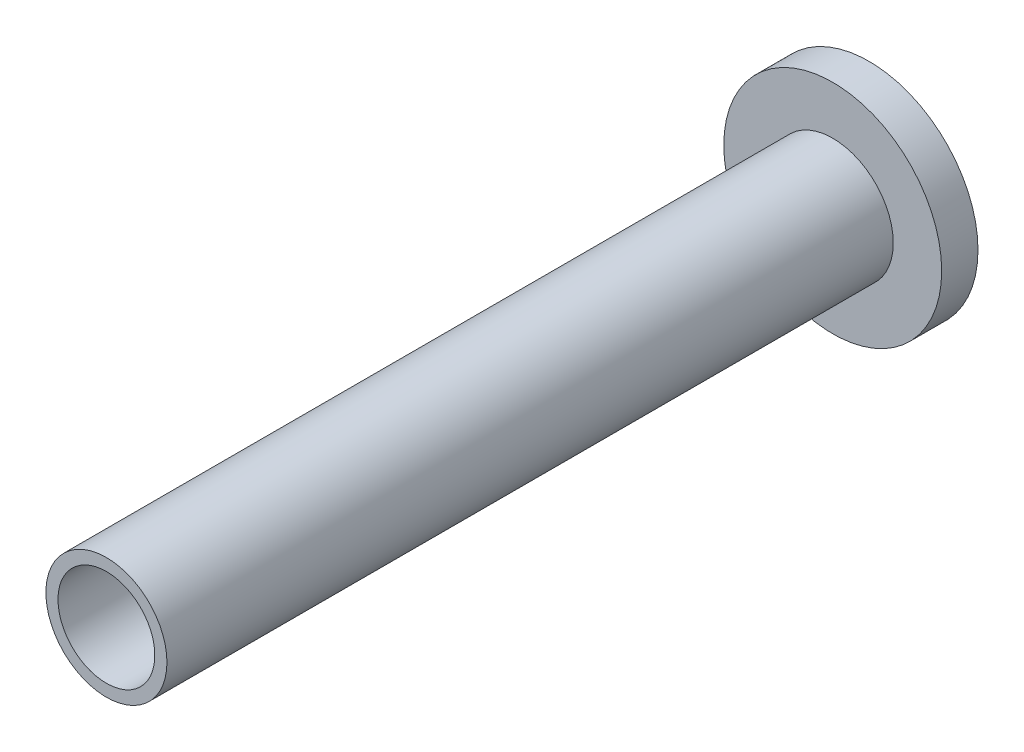
ISO-10303-21;
HEADER;
FILE_DESCRIPTION(('STEP AP214'),'2;1');
FILE_NAME('part.step','',(''),(''),'','','');
FILE_SCHEMA(('AUTOMOTIVE_DESIGN { 1 0 10303 214 1 1 1 1 }'));
ENDSEC;
DATA;
#1=APPLICATION_CONTEXT('core data for automotive mechanical design processes');
#2=APPLICATION_PROTOCOL_DEFINITION('international standard','automotive_design',2000,#1);
#3=PRODUCT_CONTEXT('',#1,'mechanical');
#4=PRODUCT('Part','Part','',(#3));
#5=PRODUCT_RELATED_PRODUCT_CATEGORY('part','',(#4));
#6=PRODUCT_DEFINITION_FORMATION('','',#4);
#7=PRODUCT_DEFINITION_CONTEXT('part definition',#1,'design');
#8=PRODUCT_DEFINITION('design','',#6,#7);
#9=PRODUCT_DEFINITION_SHAPE('','',#8);
#10=(LENGTH_UNIT() NAMED_UNIT(*) SI_UNIT(.MILLI.,.METRE.));
#11=(NAMED_UNIT(*) PLANE_ANGLE_UNIT() SI_UNIT($,.RADIAN.));
#12=(NAMED_UNIT(*) SI_UNIT($,.STERADIAN.) SOLID_ANGLE_UNIT());
#13=UNCERTAINTY_MEASURE_WITH_UNIT(LENGTH_MEASURE(1.E-05),#10,'distance_accuracy_value','');
#14=(GEOMETRIC_REPRESENTATION_CONTEXT(3) GLOBAL_UNCERTAINTY_ASSIGNED_CONTEXT((#13)) GLOBAL_UNIT_ASSIGNED_CONTEXT((#10,
#11,#12)) REPRESENTATION_CONTEXT('',''));
#15=CARTESIAN_POINT('',(0.,0.,0.));
#16=DIRECTION('',(0.,0.,1.));
#17=DIRECTION('',(1.,0.,0.));
#18=AXIS2_PLACEMENT_3D('',#15,#16,#17);
#19=CARTESIAN_POINT('',(0.,0.,30.));
#20=DIRECTION('',(0.,0.,-1.));
#21=DIRECTION('',(-1.,0.,0.));
#22=AXIS2_PLACEMENT_3D('',#19,#20,#21);
#23=CYLINDRICAL_SURFACE('',#22,2.5);
#24=CARTESIAN_POINT('',(0.,0.,30.));
#25=DIRECTION('',(0.,0.,1.));
#26=DIRECTION('',(1.,0.,0.));
#27=AXIS2_PLACEMENT_3D('',#24,#25,#26);
#28=CIRCLE('',#27,2.5);
#29=CARTESIAN_POINT('',(2.5,0.,30.));
#30=VERTEX_POINT('',#29);
#31=EDGE_CURVE('E11',#30,#30,#28,.T.);
#32=ORIENTED_EDGE('',*,*,#31,.F.);
#33=EDGE_LOOP('',(#32));
#34=FACE_BOUND('',#33,.T.);
#35=CARTESIAN_POINT('',(0.,0.,0.));
#36=DIRECTION('',(0.,0.,1.));
#37=DIRECTION('',(1.,0.,0.));
#38=AXIS2_PLACEMENT_3D('',#35,#36,#37);
#39=CIRCLE('',#38,2.5);
#40=CARTESIAN_POINT('',(2.5,0.,0.));
#41=VERTEX_POINT('',#40);
#42=EDGE_CURVE('E57',#41,#41,#39,.T.);
#43=ORIENTED_EDGE('',*,*,#42,.T.);
#44=EDGE_LOOP('',(#43));
#45=FACE_BOUND('',#44,.T.);
#46=ADVANCED_FACE('F49',(#34,#45),#23,.T.);
#47=CARTESIAN_POINT('',(0.,0.,30.));
#48=DIRECTION('',(0.,0.,1.));
#49=DIRECTION('',(1.,0.,0.));
#50=AXIS2_PLACEMENT_3D('',#47,#48,#49);
#51=PLANE('',#50);
#52=CARTESIAN_POINT('',(0.,0.,30.));
#53=DIRECTION('',(0.,0.,1.));
#54=DIRECTION('',(1.,0.,0.));
#55=AXIS2_PLACEMENT_3D('',#52,#53,#54);
#56=CIRCLE('',#55,2.);
#57=CARTESIAN_POINT('',(-2.,0.,30.));
#58=VERTEX_POINT('',#57);
#59=EDGE_CURVE('E52',#58,#58,#56,.F.);
#60=ORIENTED_EDGE('',*,*,#59,.T.);
#61=EDGE_LOOP('',(#60));
#62=FACE_BOUND('',#61,.T.);
#63=ORIENTED_EDGE('',*,*,#31,.T.);
#64=EDGE_LOOP('',(#63));
#65=FACE_BOUND('',#64,.T.);
#66=ADVANCED_FACE('F242',(#62,#65),#51,.T.);
#67=CARTESIAN_POINT('',(0.,0.,0.));
#68=DIRECTION('',(0.,0.,1.));
#69=DIRECTION('',(1.,0.,0.));
#70=AXIS2_PLACEMENT_3D('',#67,#68,#69);
#71=PLANE('',#70);
#72=CARTESIAN_POINT('',(0.,0.,0.));
#73=DIRECTION('',(0.,0.,1.));
#74=DIRECTION('',(1.,0.,0.));
#75=AXIS2_PLACEMENT_3D('',#72,#73,#74);
#76=CIRCLE('',#75,4.5);
#77=CARTESIAN_POINT('',(4.5,0.,0.));
#78=VERTEX_POINT('',#77);
#79=EDGE_CURVE('E159',#78,#78,#76,.T.);
#80=ORIENTED_EDGE('',*,*,#79,.T.);
#81=EDGE_LOOP('',(#80));
#82=FACE_BOUND('',#81,.T.);
#83=ORIENTED_EDGE('',*,*,#42,.F.);
#84=EDGE_LOOP('',(#83));
#85=FACE_BOUND('',#84,.T.);
#86=ADVANCED_FACE('F240',(#82,#85),#71,.T.);
#87=CARTESIAN_POINT('',(0.115769453402899,0.,-1.5));
#88=DIRECTION('',(1.,0.,0.));
#89=DIRECTION('',(0.,0.,-1.));
#90=AXIS2_PLACEMENT_3D('',#87,#88,#89);
#91=PLANE('',#90);
#92=DIRECTION('',(0.,1.,0.));
#93=VECTOR('',#92,1.);
#94=CARTESIAN_POINT('',(0.115769453402899,0.,0.));
#95=LINE('',#94,#93);
#96=CARTESIAN_POINT('',(0.115769453402899,-1.71873111590303,0.));
#97=VERTEX_POINT('',#96);
#98=CARTESIAN_POINT('',(0.115769453402899,-0.115769453402899,0.));
#99=VERTEX_POINT('',#98);
#100=EDGE_CURVE('E65',#97,#99,#95,.T.);
#101=ORIENTED_EDGE('',*,*,#100,.T.);
#102=DIRECTION('',(0.,0.,1.));
#103=VECTOR('',#102,1.);
#104=CARTESIAN_POINT('',(0.115769453402899,-0.115769453402899,-1.5));
#105=LINE('',#104,#103);
#106=CARTESIAN_POINT('',(0.115769453402899,-0.115769453402899,-1.5));
#107=VERTEX_POINT('',#106);
#108=EDGE_CURVE('E158',#107,#99,#105,.T.);
#109=ORIENTED_EDGE('',*,*,#108,.F.);
#110=DIRECTION('',(0.,1.,0.));
#111=VECTOR('',#110,1.);
#112=CARTESIAN_POINT('',(0.115769453402899,0.,-1.5));
#113=LINE('',#112,#111);
#114=CARTESIAN_POINT('',(0.115769453402899,-1.71873111590303,-1.5));
#115=VERTEX_POINT('',#114);
#116=EDGE_CURVE('E143',#115,#107,#113,.T.);
#117=ORIENTED_EDGE('',*,*,#116,.F.);
#118=DIRECTION('',(0.,0.,1.));
#119=VECTOR('',#118,1.);
#120=CARTESIAN_POINT('',(0.115769453402899,-1.71873111590303,-1.5));
#121=LINE('',#120,#119);
#122=EDGE_CURVE('E150',#115,#97,#121,.T.);
#123=ORIENTED_EDGE('',*,*,#122,.T.);
#124=EDGE_LOOP('',(#101,#109,#117,#123));
#125=FACE_BOUND('',#124,.T.);
#126=ADVANCED_FACE('F156',(#125),#91,.F.);
#127=CARTESIAN_POINT('',(0.,-0.115769453402899,-1.5));
#128=DIRECTION('',(0.,-1.,0.));
#129=DIRECTION('',(0.,0.,-1.));
#130=AXIS2_PLACEMENT_3D('',#127,#128,#129);
#131=PLANE('',#130);
#132=DIRECTION('',(1.,0.,0.));
#133=VECTOR('',#132,1.);
#134=CARTESIAN_POINT('',(0.,-0.115769453402899,0.));
#135=LINE('',#134,#133);
#136=CARTESIAN_POINT('',(1.71873111590303,-0.115769453402899,0.));
#137=VERTEX_POINT('',#136);
#138=EDGE_CURVE('E163',#99,#137,#135,.T.);
#139=ORIENTED_EDGE('',*,*,#138,.T.);
#140=DIRECTION('',(0.,0.,1.));
#141=VECTOR('',#140,1.);
#142=CARTESIAN_POINT('',(1.71873111590303,-0.115769453402899,-1.5));
#143=LINE('',#142,#141);
#144=CARTESIAN_POINT('',(1.71873111590303,-0.115769453402899,-1.5));
#145=VERTEX_POINT('',#144);
#146=EDGE_CURVE('E210',#145,#137,#143,.T.);
#147=ORIENTED_EDGE('',*,*,#146,.F.);
#148=DIRECTION('',(1.,0.,0.));
#149=VECTOR('',#148,1.);
#150=CARTESIAN_POINT('',(0.,-0.115769453402899,-1.5));
#151=LINE('',#150,#149);
#152=EDGE_CURVE('E187',#107,#145,#151,.T.);
#153=ORIENTED_EDGE('',*,*,#152,.F.);
#154=ORIENTED_EDGE('',*,*,#108,.T.);
#155=EDGE_LOOP('',(#139,#147,#153,#154));
#156=FACE_BOUND('',#155,.T.);
#157=ADVANCED_FACE('F249',(#156),#131,.F.);
#158=CARTESIAN_POINT('',(1.71873111590303,0.,-1.5));
#159=DIRECTION('',(-1.,0.,0.));
#160=DIRECTION('',(0.,0.,1.));
#161=AXIS2_PLACEMENT_3D('',#158,#159,#160);
#162=PLANE('',#161);
#163=DIRECTION('',(0.,-1.,0.));
#164=VECTOR('',#163,1.);
#165=CARTESIAN_POINT('',(1.71873111590303,0.,0.));
#166=LINE('',#165,#164);
#167=CARTESIAN_POINT('',(1.71873111590303,0.115769453402899,0.));
#168=VERTEX_POINT('',#167);
#169=EDGE_CURVE('E207',#168,#137,#166,.T.);
#170=ORIENTED_EDGE('',*,*,#169,.F.);
#171=DIRECTION('',(0.,0.,1.));
#172=VECTOR('',#171,1.);
#173=CARTESIAN_POINT('',(1.71873111590303,0.115769453402899,-1.5));
#174=LINE('',#173,#172);
#175=CARTESIAN_POINT('',(1.71873111590303,0.115769453402899,-1.5));
#176=VERTEX_POINT('',#175);
#177=EDGE_CURVE('E213',#176,#168,#174,.T.);
#178=ORIENTED_EDGE('',*,*,#177,.F.);
#179=DIRECTION('',(0.,-1.,0.));
#180=VECTOR('',#179,1.);
#181=CARTESIAN_POINT('',(1.71873111590303,0.,-1.5));
#182=LINE('',#181,#180);
#183=EDGE_CURVE('E173',#176,#145,#182,.T.);
#184=ORIENTED_EDGE('',*,*,#183,.T.);
#185=ORIENTED_EDGE('',*,*,#146,.T.);
#186=EDGE_LOOP('',(#170,#178,#184,#185));
#187=FACE_BOUND('',#186,.T.);
#188=ADVANCED_FACE('F298',(#187),#162,.T.);
#189=CARTESIAN_POINT('',(0.,0.115769453402899,-1.5));
#190=DIRECTION('',(0.,-1.,0.));
#191=DIRECTION('',(0.,0.,-1.));
#192=AXIS2_PLACEMENT_3D('',#189,#190,#191);
#193=PLANE('',#192);
#194=DIRECTION('',(1.,0.,0.));
#195=VECTOR('',#194,1.);
#196=CARTESIAN_POINT('',(0.,0.115769453402899,0.));
#197=LINE('',#196,#195);
#198=CARTESIAN_POINT('',(0.115769453402899,0.115769453402899,0.));
#199=VERTEX_POINT('',#198);
#200=EDGE_CURVE('E204',#199,#168,#197,.T.);
#201=ORIENTED_EDGE('',*,*,#200,.F.);
#202=DIRECTION('',(0.,0.,1.));
#203=VECTOR('',#202,1.);
#204=CARTESIAN_POINT('',(0.115769453402899,0.115769453402899,-1.5));
#205=LINE('',#204,#203);
#206=CARTESIAN_POINT('',(0.115769453402899,0.115769453402899,-1.5));
#207=VERTEX_POINT('',#206);
#208=EDGE_CURVE('E216',#207,#199,#205,.T.);
#209=ORIENTED_EDGE('',*,*,#208,.F.);
#210=DIRECTION('',(1.,0.,0.));
#211=VECTOR('',#210,1.);
#212=CARTESIAN_POINT('',(0.,0.115769453402899,-1.5));
#213=LINE('',#212,#211);
#214=EDGE_CURVE('E166',#207,#176,#213,.T.);
#215=ORIENTED_EDGE('',*,*,#214,.T.);
#216=ORIENTED_EDGE('',*,*,#177,.T.);
#217=EDGE_LOOP('',(#201,#209,#215,#216));
#218=FACE_BOUND('',#217,.T.);
#219=ADVANCED_FACE('F309',(#218),#193,.T.);
#220=CARTESIAN_POINT('',(0.115769453402899,1.71873111590303,0.));
#221=VERTEX_POINT('',#220);
#222=EDGE_CURVE('E191',#199,#221,#95,.T.);
#223=ORIENTED_EDGE('',*,*,#222,.T.);
#224=DIRECTION('',(0.,0.,1.));
#225=VECTOR('',#224,1.);
#226=CARTESIAN_POINT('',(0.115769453402899,1.71873111590303,-1.5));
#227=LINE('',#226,#225);
#228=CARTESIAN_POINT('',(0.115769453402899,1.71873111590303,-1.5));
#229=VERTEX_POINT('',#228);
#230=EDGE_CURVE('E219',#229,#221,#227,.T.);
#231=ORIENTED_EDGE('',*,*,#230,.F.);
#232=EDGE_CURVE('E161',#207,#229,#113,.T.);
#233=ORIENTED_EDGE('',*,*,#232,.F.);
#234=ORIENTED_EDGE('',*,*,#208,.T.);
#235=EDGE_LOOP('',(#223,#231,#233,#234));
#236=FACE_BOUND('',#235,.T.);
#237=ADVANCED_FACE('F251',(#236),#91,.F.);
#238=CARTESIAN_POINT('',(0.,1.71873111590303,-1.5));
#239=DIRECTION('',(0.,-1.,0.));
#240=DIRECTION('',(0.,0.,-1.));
#241=AXIS2_PLACEMENT_3D('',#238,#239,#240);
#242=PLANE('',#241);
#243=DIRECTION('',(1.,0.,0.));
#244=VECTOR('',#243,1.);
#245=CARTESIAN_POINT('',(0.,1.71873111590303,0.));
#246=LINE('',#245,#244);
#247=CARTESIAN_POINT('',(-0.115769453402899,1.71873111590303,0.));
#248=VERTEX_POINT('',#247);
#249=EDGE_CURVE('E205',#248,#221,#246,.T.);
#250=ORIENTED_EDGE('',*,*,#249,.F.);
#251=DIRECTION('',(0.,0.,1.));
#252=VECTOR('',#251,1.);
#253=CARTESIAN_POINT('',(-0.115769453402899,1.71873111590303,-1.5));
#254=LINE('',#253,#252);
#255=CARTESIAN_POINT('',(-0.115769453402899,1.71873111590303,-1.5));
#256=VERTEX_POINT('',#255);
#257=EDGE_CURVE('E221',#256,#248,#254,.T.);
#258=ORIENTED_EDGE('',*,*,#257,.F.);
#259=DIRECTION('',(1.,0.,0.));
#260=VECTOR('',#259,1.);
#261=CARTESIAN_POINT('',(0.,1.71873111590303,-1.5));
#262=LINE('',#261,#260);
#263=EDGE_CURVE('E167',#256,#229,#262,.T.);
#264=ORIENTED_EDGE('',*,*,#263,.T.);
#265=ORIENTED_EDGE('',*,*,#230,.T.);
#266=EDGE_LOOP('',(#250,#258,#264,#265));
#267=FACE_BOUND('',#266,.T.);
#268=ADVANCED_FACE('F329',(#267),#242,.T.);
#269=CARTESIAN_POINT('',(-0.115769453402899,0.,-1.5));
#270=DIRECTION('',(1.,0.,0.));
#271=DIRECTION('',(0.,0.,-1.));
#272=AXIS2_PLACEMENT_3D('',#269,#270,#271);
#273=PLANE('',#272);
#274=DIRECTION('',(0.,1.,0.));
#275=VECTOR('',#274,1.);
#276=CARTESIAN_POINT('',(-0.115769453402899,0.,0.));
#277=LINE('',#276,#275);
#278=CARTESIAN_POINT('',(-0.115769453402899,0.115769453402899,0.));
#279=VERTEX_POINT('',#278);
#280=EDGE_CURVE('E196',#279,#248,#277,.T.);
#281=ORIENTED_EDGE('',*,*,#280,.F.);
#282=DIRECTION('',(0.,0.,1.));
#283=VECTOR('',#282,1.);
#284=CARTESIAN_POINT('',(-0.115769453402899,0.115769453402899,-1.5));
#285=LINE('',#284,#283);
#286=CARTESIAN_POINT('',(-0.115769453402899,0.115769453402899,-1.5));
#287=VERTEX_POINT('',#286);
#288=EDGE_CURVE('E224',#287,#279,#285,.T.);
#289=ORIENTED_EDGE('',*,*,#288,.F.);
#290=DIRECTION('',(0.,1.,0.));
#291=VECTOR('',#290,1.);
#292=CARTESIAN_POINT('',(-0.115769453402899,0.,-1.5));
#293=LINE('',#292,#291);
#294=EDGE_CURVE('E177',#287,#256,#293,.T.);
#295=ORIENTED_EDGE('',*,*,#294,.T.);
#296=ORIENTED_EDGE('',*,*,#257,.T.);
#297=EDGE_LOOP('',(#281,#289,#295,#296));
#298=FACE_BOUND('',#297,.T.);
#299=ADVANCED_FACE('F338',(#298),#273,.T.);
#300=CARTESIAN_POINT('',(-1.71873111590303,0.115769453402899,0.));
#301=VERTEX_POINT('',#300);
#302=EDGE_CURVE('E202',#301,#279,#197,.T.);
#303=ORIENTED_EDGE('',*,*,#302,.F.);
#304=DIRECTION('',(0.,0.,1.));
#305=VECTOR('',#304,1.);
#306=CARTESIAN_POINT('',(-1.71873111590303,0.115769453402899,-1.5));
#307=LINE('',#306,#305);
#308=CARTESIAN_POINT('',(-1.71873111590303,0.115769453402899,-1.5));
#309=VERTEX_POINT('',#308);
#310=EDGE_CURVE('E227',#309,#301,#307,.T.);
#311=ORIENTED_EDGE('',*,*,#310,.F.);
#312=EDGE_CURVE('E175',#309,#287,#213,.T.);
#313=ORIENTED_EDGE('',*,*,#312,.T.);
#314=ORIENTED_EDGE('',*,*,#288,.T.);
#315=EDGE_LOOP('',(#303,#311,#313,#314));
#316=FACE_BOUND('',#315,.T.);
#317=ADVANCED_FACE('F321',(#316),#193,.T.);
#318=CARTESIAN_POINT('',(-1.71873111590303,0.,-1.5));
#319=DIRECTION('',(-1.,0.,0.));
#320=DIRECTION('',(0.,0.,1.));
#321=AXIS2_PLACEMENT_3D('',#318,#319,#320);
#322=PLANE('',#321);
#323=DIRECTION('',(0.,-1.,0.));
#324=VECTOR('',#323,1.);
#325=CARTESIAN_POINT('',(-1.71873111590303,0.,0.));
#326=LINE('',#325,#324);
#327=CARTESIAN_POINT('',(-1.71873111590303,-0.115769453402899,0.));
#328=VERTEX_POINT('',#327);
#329=EDGE_CURVE('E199',#301,#328,#326,.T.);
#330=ORIENTED_EDGE('',*,*,#329,.T.);
#331=DIRECTION('',(0.,0.,1.));
#332=VECTOR('',#331,1.);
#333=CARTESIAN_POINT('',(-1.71873111590303,-0.115769453402899,-1.5));
#334=LINE('',#333,#332);
#335=CARTESIAN_POINT('',(-1.71873111590303,-0.115769453402899,-1.5));
#336=VERTEX_POINT('',#335);
#337=EDGE_CURVE('E230',#336,#328,#334,.T.);
#338=ORIENTED_EDGE('',*,*,#337,.F.);
#339=DIRECTION('',(0.,-1.,0.));
#340=VECTOR('',#339,1.);
#341=CARTESIAN_POINT('',(-1.71873111590303,0.,-1.5));
#342=LINE('',#341,#340);
#343=EDGE_CURVE('E453',#309,#336,#342,.T.);
#344=ORIENTED_EDGE('',*,*,#343,.F.);
#345=ORIENTED_EDGE('',*,*,#310,.T.);
#346=EDGE_LOOP('',(#330,#338,#344,#345));
#347=FACE_BOUND('',#346,.T.);
#348=ADVANCED_FACE('F357',(#347),#322,.F.);
#349=CARTESIAN_POINT('',(-0.115769453402899,-0.115769453402899,0.));
#350=VERTEX_POINT('',#349);
#351=EDGE_CURVE('E195',#328,#350,#135,.T.);
#352=ORIENTED_EDGE('',*,*,#351,.T.);
#353=DIRECTION('',(0.,0.,1.));
#354=VECTOR('',#353,1.);
#355=CARTESIAN_POINT('',(-0.115769453402899,-0.115769453402899,-1.5));
#356=LINE('',#355,#354);
#357=CARTESIAN_POINT('',(-0.115769453402899,-0.115769453402899,-1.5));
#358=VERTEX_POINT('',#357);
#359=EDGE_CURVE('E233',#358,#350,#356,.T.);
#360=ORIENTED_EDGE('',*,*,#359,.F.);
#361=EDGE_CURVE('E452',#336,#358,#151,.T.);
#362=ORIENTED_EDGE('',*,*,#361,.F.);
#363=ORIENTED_EDGE('',*,*,#337,.T.);
#364=EDGE_LOOP('',(#352,#360,#362,#363));
#365=FACE_BOUND('',#364,.T.);
#366=ADVANCED_FACE('F301',(#365),#131,.F.);
#367=CARTESIAN_POINT('',(-0.115769453402899,-1.71873111590303,0.));
#368=VERTEX_POINT('',#367);
#369=EDGE_CURVE('E193',#368,#350,#277,.T.);
#370=ORIENTED_EDGE('',*,*,#369,.F.);
#371=DIRECTION('',(0.,0.,1.));
#372=VECTOR('',#371,1.);
#373=CARTESIAN_POINT('',(-0.115769453402899,-1.71873111590303,-1.5));
#374=LINE('',#373,#372);
#375=CARTESIAN_POINT('',(-0.115769453402899,-1.71873111590303,-1.5));
#376=VERTEX_POINT('',#375);
#377=EDGE_CURVE('E153',#376,#368,#374,.T.);
#378=ORIENTED_EDGE('',*,*,#377,.F.);
#379=EDGE_CURVE('E146',#376,#358,#293,.T.);
#380=ORIENTED_EDGE('',*,*,#379,.T.);
#381=ORIENTED_EDGE('',*,*,#359,.T.);
#382=EDGE_LOOP('',(#370,#378,#380,#381));
#383=FACE_BOUND('',#382,.T.);
#384=ADVANCED_FACE('F349',(#383),#273,.T.);
#385=CARTESIAN_POINT('',(0.,-1.71873111590303,-1.5));
#386=DIRECTION('',(0.,-1.,0.));
#387=DIRECTION('',(0.,0.,-1.));
#388=AXIS2_PLACEMENT_3D('',#385,#386,#387);
#389=PLANE('',#388);
#390=DIRECTION('',(1.,0.,0.));
#391=VECTOR('',#390,1.);
#392=CARTESIAN_POINT('',(0.,-1.71873111590303,0.));
#393=LINE('',#392,#391);
#394=EDGE_CURVE('E69',#368,#97,#393,.T.);
#395=ORIENTED_EDGE('',*,*,#394,.T.);
#396=ORIENTED_EDGE('',*,*,#122,.F.);
#397=DIRECTION('',(1.,0.,0.));
#398=VECTOR('',#397,1.);
#399=CARTESIAN_POINT('',(0.,-1.71873111590303,-1.5));
#400=LINE('',#399,#398);
#401=EDGE_CURVE('E138',#376,#115,#400,.T.);
#402=ORIENTED_EDGE('',*,*,#401,.F.);
#403=ORIENTED_EDGE('',*,*,#377,.T.);
#404=EDGE_LOOP('',(#395,#396,#402,#403));
#405=FACE_BOUND('',#404,.T.);
#406=ADVANCED_FACE('F151',(#405),#389,.F.);
#407=CARTESIAN_POINT('',(0.,0.,-1.5));
#408=DIRECTION('',(0.,0.,1.));
#409=DIRECTION('',(1.,0.,0.));
#410=AXIS2_PLACEMENT_3D('',#407,#408,#409);
#411=CYLINDRICAL_SURFACE('',#410,4.5);
#412=CARTESIAN_POINT('',(0.,0.,-1.5));
#413=DIRECTION('',(0.,0.,1.));
#414=DIRECTION('',(1.,0.,0.));
#415=AXIS2_PLACEMENT_3D('',#412,#413,#414);
#416=CIRCLE('',#415,4.5);
#417=CARTESIAN_POINT('',(4.5,0.,-1.5));
#418=VERTEX_POINT('',#417);
#419=EDGE_CURVE('E154',#418,#418,#416,.T.);
#420=ORIENTED_EDGE('',*,*,#419,.T.);
#421=EDGE_LOOP('',(#420));
#422=FACE_BOUND('',#421,.T.);
#423=ORIENTED_EDGE('',*,*,#79,.F.);
#424=EDGE_LOOP('',(#423));
#425=FACE_BOUND('',#424,.T.);
#426=ADVANCED_FACE('F391',(#422,#425),#411,.T.);
#427=CARTESIAN_POINT('',(0.,0.,-1.5));
#428=DIRECTION('',(0.,0.,1.));
#429=DIRECTION('',(1.,0.,0.));
#430=AXIS2_PLACEMENT_3D('',#427,#428,#429);
#431=PLANE('',#430);
#432=ORIENTED_EDGE('',*,*,#116,.T.);
#433=ORIENTED_EDGE('',*,*,#152,.T.);
#434=ORIENTED_EDGE('',*,*,#183,.F.);
#435=ORIENTED_EDGE('',*,*,#214,.F.);
#436=ORIENTED_EDGE('',*,*,#232,.T.);
#437=ORIENTED_EDGE('',*,*,#263,.F.);
#438=ORIENTED_EDGE('',*,*,#294,.F.);
#439=ORIENTED_EDGE('',*,*,#312,.F.);
#440=ORIENTED_EDGE('',*,*,#343,.T.);
#441=ORIENTED_EDGE('',*,*,#361,.T.);
#442=ORIENTED_EDGE('',*,*,#379,.F.);
#443=ORIENTED_EDGE('',*,*,#401,.T.);
#444=EDGE_LOOP('',(#432,#433,#434,#435,#436,#437,#438,#439,#440,#441,#442,#443));
#445=FACE_BOUND('',#444,.T.);
#446=ORIENTED_EDGE('',*,*,#419,.F.);
#447=EDGE_LOOP('',(#446));
#448=FACE_BOUND('',#447,.T.);
#449=ADVANCED_FACE('F140',(#445,#448),#431,.F.);
#450=CARTESIAN_POINT('',(0.,0.,0.));
#451=DIRECTION('',(0.,0.,1.));
#452=DIRECTION('',(1.,0.,0.));
#453=AXIS2_PLACEMENT_3D('',#450,#451,#452);
#454=PLANE('',#453);
#455=ORIENTED_EDGE('',*,*,#100,.F.);
#456=ORIENTED_EDGE('',*,*,#394,.F.);
#457=ORIENTED_EDGE('',*,*,#369,.T.);
#458=ORIENTED_EDGE('',*,*,#351,.F.);
#459=ORIENTED_EDGE('',*,*,#329,.F.);
#460=ORIENTED_EDGE('',*,*,#302,.T.);
#461=ORIENTED_EDGE('',*,*,#280,.T.);
#462=ORIENTED_EDGE('',*,*,#249,.T.);
#463=ORIENTED_EDGE('',*,*,#222,.F.);
#464=ORIENTED_EDGE('',*,*,#200,.T.);
#465=ORIENTED_EDGE('',*,*,#169,.T.);
#466=ORIENTED_EDGE('',*,*,#138,.F.);
#467=EDGE_LOOP('',(#455,#456,#457,#458,#459,#460,#461,#462,#463,#464,#465,#466));
#468=FACE_BOUND('',#467,.T.);
#469=ADVANCED_FACE('F277',(#468),#454,.F.);
#470=CARTESIAN_POINT('',(0.,0.,30.000012));
#471=DIRECTION('',(0.,0.,-1.));
#472=DIRECTION('',(-1.,0.,0.));
#473=AXIS2_PLACEMENT_3D('',#470,#471,#472);
#474=CYLINDRICAL_SURFACE('',#473,2.);
#475=CARTESIAN_POINT('',(0.,0.,20.));
#476=DIRECTION('',(0.,0.,1.));
#477=DIRECTION('',(1.,0.,0.));
#478=AXIS2_PLACEMENT_3D('',#475,#476,#477);
#479=CIRCLE('',#478,2.);
#480=CARTESIAN_POINT('',(-2.,0.,20.));
#481=VERTEX_POINT('',#480);
#482=EDGE_CURVE('E431',#481,#481,#479,.T.);
#483=CARTESIAN_POINT('',(-2.,0.,30.));
#484=CARTESIAN_POINT('',(-2.,0.,29.8958333333333));
#485=CARTESIAN_POINT('',(-2.,0.,29.7916666666667));
#486=CARTESIAN_POINT('',(-2.,0.,29.5833333333333));
#487=CARTESIAN_POINT('',(-2.,0.,29.4791666666667));
#488=CARTESIAN_POINT('',(-2.,0.,29.2708333333333));
#489=CARTESIAN_POINT('',(-2.,0.,29.1666666666667));
#490=CARTESIAN_POINT('',(-2.,0.,28.9583333333333));
#491=CARTESIAN_POINT('',(-2.,0.,28.8541666666667));
#492=CARTESIAN_POINT('',(-2.,0.,28.6458333333333));
#493=CARTESIAN_POINT('',(-2.,0.,28.5416666666667));
#494=CARTESIAN_POINT('',(-2.,0.,28.3333333333333));
#495=CARTESIAN_POINT('',(-2.,0.,28.2291666666667));
#496=CARTESIAN_POINT('',(-2.,0.,28.0208333333333));
#497=CARTESIAN_POINT('',(-2.,0.,27.9166666666667));
#498=CARTESIAN_POINT('',(-2.,0.,27.7083333333333));
#499=CARTESIAN_POINT('',(-2.,0.,27.6041666666667));
#500=CARTESIAN_POINT('',(-2.,0.,27.3958333333333));
#501=CARTESIAN_POINT('',(-2.,0.,27.2916666666667));
#502=CARTESIAN_POINT('',(-2.,0.,27.0833333333333));
#503=CARTESIAN_POINT('',(-2.,0.,26.9791666666667));
#504=CARTESIAN_POINT('',(-2.,0.,26.7708333333333));
#505=CARTESIAN_POINT('',(-2.,0.,26.6666666666667));
#506=CARTESIAN_POINT('',(-2.,0.,26.4583333333333));
#507=CARTESIAN_POINT('',(-2.,0.,26.3541666666667));
#508=CARTESIAN_POINT('',(-2.,0.,26.1458333333333));
#509=CARTESIAN_POINT('',(-2.,0.,26.0416666666667));
#510=CARTESIAN_POINT('',(-2.,0.,25.8333333333333));
#511=CARTESIAN_POINT('',(-2.,0.,25.7291666666667));
#512=CARTESIAN_POINT('',(-2.,0.,25.5208333333333));
#513=CARTESIAN_POINT('',(-2.,0.,25.4166666666667));
#514=CARTESIAN_POINT('',(-2.,0.,25.2083333333333));
#515=CARTESIAN_POINT('',(-2.,0.,25.1041666666667));
#516=CARTESIAN_POINT('',(-2.,0.,24.8958333333333));
#517=CARTESIAN_POINT('',(-2.,0.,24.7916666666667));
#518=CARTESIAN_POINT('',(-2.,0.,24.5833333333333));
#519=CARTESIAN_POINT('',(-2.,0.,24.4791666666667));
#520=CARTESIAN_POINT('',(-2.,0.,24.2708333333333));
#521=CARTESIAN_POINT('',(-2.,0.,24.1666666666667));
#522=CARTESIAN_POINT('',(-2.,0.,23.9583333333333));
#523=CARTESIAN_POINT('',(-2.,0.,23.8541666666667));
#524=CARTESIAN_POINT('',(-2.,0.,23.6458333333333));
#525=CARTESIAN_POINT('',(-2.,0.,23.5416666666667));
#526=CARTESIAN_POINT('',(-2.,0.,23.3333333333333));
#527=CARTESIAN_POINT('',(-2.,0.,23.2291666666667));
#528=CARTESIAN_POINT('',(-2.,0.,23.0208333333333));
#529=CARTESIAN_POINT('',(-2.,0.,22.9166666666667));
#530=CARTESIAN_POINT('',(-2.,0.,22.7083333333333));
#531=CARTESIAN_POINT('',(-2.,0.,22.6041666666667));
#532=CARTESIAN_POINT('',(-2.,0.,22.3958333333333));
#533=CARTESIAN_POINT('',(-2.,0.,22.2916666666667));
#534=CARTESIAN_POINT('',(-2.,0.,22.0833333333333));
#535=CARTESIAN_POINT('',(-2.,0.,21.9791666666667));
#536=CARTESIAN_POINT('',(-2.,0.,21.7708333333333));
#537=CARTESIAN_POINT('',(-2.,0.,21.6666666666667));
#538=CARTESIAN_POINT('',(-2.,0.,21.4583333333333));
#539=CARTESIAN_POINT('',(-2.,0.,21.3541666666667));
#540=CARTESIAN_POINT('',(-2.,0.,21.1458333333333));
#541=CARTESIAN_POINT('',(-2.,0.,21.0416666666667));
#542=CARTESIAN_POINT('',(-2.,0.,20.8333333333333));
#543=CARTESIAN_POINT('',(-2.,0.,20.7291666666667));
#544=CARTESIAN_POINT('',(-2.,0.,20.5208333333333));
#545=CARTESIAN_POINT('',(-2.,0.,20.4166666666667));
#546=CARTESIAN_POINT('',(-2.,0.,20.2083333333333));
#547=CARTESIAN_POINT('',(-2.,0.,20.1041666666667));
#548=CARTESIAN_POINT('',(-2.,0.,20.));
#549=B_SPLINE_CURVE_WITH_KNOTS('',3,(#483,#484,#485,#486,#487,#488,#489,#490,#491,#492,#493,
#494,#495,#496,#497,#498,#499,#500,#501,#502,#503,#504,#505,#506,#507,#508,#509,#510,#511,#512,
#513,#514,#515,#516,#517,#518,#519,#520,#521,#522,#523,#524,#525,#526,#527,#528,#529,#530,#531,
#532,#533,#534,#535,#536,#537,#538,#539,#540,#541,#542,#543,#544,#545,#546,#547,#548),
.UNSPECIFIED.,.F.,.F.,(4,2,2,2,2,2,2,2,2,2,2,2,2,2,2,2,2,2,2,2,2,2,2,2,2,2,2,2,2,2,2,2,4),(0.,
0.312499999999997,0.624999999999997,0.937499999999997,1.25,1.5625,1.875,2.1875,2.5,2.8125,3.125,
3.4375,3.75,4.0625,4.375,4.6875,5.,5.3125,5.625,5.9375,6.25,6.5625,6.875,7.1875,7.5,7.8125,
8.125,8.4375,8.75,9.0625,9.375,9.6875,10.),.UNSPECIFIED.);
#550=EDGE_CURVE('BSEAM280',#58,#481,#549,.T.);
#551=ORIENTED_EDGE('',*,*,#59,.F.);
#552=ORIENTED_EDGE('',*,*,#482,.F.);
#553=ORIENTED_EDGE('',*,*,#550,.T.);
#554=ORIENTED_EDGE('',*,*,#550,.F.);
#555=EDGE_LOOP('',(#551,#553,#552,#554));
#556=FACE_BOUND('',#555,.T.);
#557=ADVANCED_FACE('F280',(#556),#474,.F.);
#558=CARTESIAN_POINT('',(0.,0.,20.));
#559=DIRECTION('',(0.,0.,1.));
#560=DIRECTION('',(1.,0.,0.));
#561=AXIS2_PLACEMENT_3D('',#558,#559,#560);
#562=PLANE('',#561);
#563=ORIENTED_EDGE('',*,*,#482,.T.);
#564=EDGE_LOOP('',(#563));
#565=FACE_BOUND('',#564,.T.);
#566=ADVANCED_FACE('F415',(#565),#562,.T.);
#567=CLOSED_SHELL('',(#46,#66,#86,#126,#157,#188,#219,#237,#268,#299,#317,#348,#366,#384,#406,
#426,#449,#469,#557,#566));
#568=MANIFOLD_SOLID_BREP('B2',#567);
#569=ADVANCED_BREP_SHAPE_REPRESENTATION('',(#18,#568),#14);
#570=SHAPE_DEFINITION_REPRESENTATION(#9,#569);
ENDSEC;
END-ISO-10303-21;
